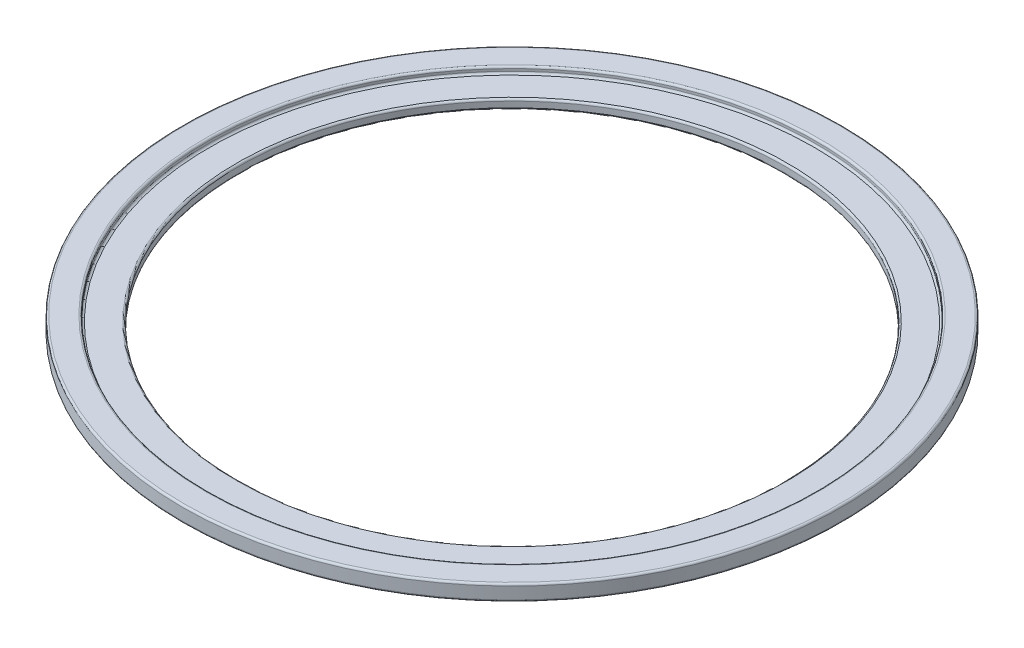
ISO-10303-21;
HEADER;
FILE_DESCRIPTION(('STEP AP214'),'2;1');
FILE_NAME('part.step','',(''),(''),'','','');
FILE_SCHEMA(('AUTOMOTIVE_DESIGN { 1 0 10303 214 1 1 1 1 }'));
ENDSEC;
DATA;
#1=APPLICATION_CONTEXT('core data for automotive mechanical design processes');
#2=APPLICATION_PROTOCOL_DEFINITION('international standard','automotive_design',2000,#1);
#3=PRODUCT_CONTEXT('',#1,'mechanical');
#4=PRODUCT('Part','Part','',(#3));
#5=PRODUCT_RELATED_PRODUCT_CATEGORY('part','',(#4));
#6=PRODUCT_DEFINITION_FORMATION('','',#4);
#7=PRODUCT_DEFINITION_CONTEXT('part definition',#1,'design');
#8=PRODUCT_DEFINITION('design','',#6,#7);
#9=PRODUCT_DEFINITION_SHAPE('','',#8);
#10=(LENGTH_UNIT() NAMED_UNIT(*) SI_UNIT(.MILLI.,.METRE.));
#11=(NAMED_UNIT(*) PLANE_ANGLE_UNIT() SI_UNIT($,.RADIAN.));
#12=(NAMED_UNIT(*) SI_UNIT($,.STERADIAN.) SOLID_ANGLE_UNIT());
#13=UNCERTAINTY_MEASURE_WITH_UNIT(LENGTH_MEASURE(1.E-05),#10,'distance_accuracy_value','');
#14=(GEOMETRIC_REPRESENTATION_CONTEXT(3) GLOBAL_UNCERTAINTY_ASSIGNED_CONTEXT((#13)) GLOBAL_UNIT_ASSIGNED_CONTEXT((#10,
#11,#12)) REPRESENTATION_CONTEXT('',''));
#15=CARTESIAN_POINT('',(0.,0.,0.));
#16=DIRECTION('',(0.,0.,1.));
#17=DIRECTION('',(1.,0.,0.));
#18=AXIS2_PLACEMENT_3D('',#15,#16,#17);
#19=CARTESIAN_POINT('',(0.,3.17320044296789,0.));
#20=DIRECTION('',(0.,-1.,0.));
#21=DIRECTION('',(0.,0.,-1.));
#22=AXIS2_PLACEMENT_3D('',#19,#20,#21);
#23=PLANE('',#22);
#24=CARTESIAN_POINT('',(0.,3.17320044296789,0.));
#25=DIRECTION('',(0.,-1.,0.));
#26=DIRECTION('',(0.,0.,-1.));
#27=AXIS2_PLACEMENT_3D('',#24,#25,#26);
#28=CIRCLE('',#27,42.25);
#29=CARTESIAN_POINT('',(0.,3.17320044296789,-42.25));
#30=VERTEX_POINT('',#29);
#31=EDGE_CURVE('E65',#30,#30,#28,.T.);
#32=ORIENTED_EDGE('',*,*,#31,.T.);
#33=EDGE_LOOP('',(#32));
#34=FACE_BOUND('',#33,.T.);
#35=CARTESIAN_POINT('',(0.,3.17320044296789,0.));
#36=DIRECTION('',(0.,-1.,0.));
#37=DIRECTION('',(0.,0.,-1.));
#38=AXIS2_PLACEMENT_3D('',#35,#36,#37);
#39=CIRCLE('',#38,35.5);
#40=CARTESIAN_POINT('',(0.,3.17320044296789,-35.5));
#41=VERTEX_POINT('',#40);
#42=EDGE_CURVE('E68',#41,#41,#39,.F.);
#43=ORIENTED_EDGE('',*,*,#42,.T.);
#44=EDGE_LOOP('',(#43));
#45=FACE_BOUND('',#44,.T.);
#46=ADVANCED_FACE('F33',(#34,#45),#23,.T.);
#47=CARTESIAN_POINT('',(0.,47.2206533776301,0.));
#48=DIRECTION('',(0.,1.,0.));
#49=DIRECTION('',(0.,0.,1.));
#50=AXIS2_PLACEMENT_3D('',#47,#48,#49);
#51=CYLINDRICAL_SURFACE('',#50,42.5);
#52=CARTESIAN_POINT('',(0.,3.42320044296789,0.));
#53=DIRECTION('',(0.,-1.,0.));
#54=DIRECTION('',(0.,0.,-1.));
#55=AXIS2_PLACEMENT_3D('',#52,#53,#54);
#56=CIRCLE('',#55,42.5);
#57=CARTESIAN_POINT('',(0.,3.42320044296789,-42.5));
#58=VERTEX_POINT('',#57);
#59=EDGE_CURVE('E71',#58,#58,#56,.F.);
#60=ORIENTED_EDGE('',*,*,#59,.T.);
#61=EDGE_LOOP('',(#60));
#62=FACE_BOUND('',#61,.T.);
#63=CARTESIAN_POINT('',(0.,4.97320044296789,0.));
#64=DIRECTION('',(0.,1.,0.));
#65=DIRECTION('',(0.,0.,1.));
#66=AXIS2_PLACEMENT_3D('',#63,#64,#65);
#67=CIRCLE('',#66,42.5);
#68=CARTESIAN_POINT('',(0.,4.97320044296789,42.5));
#69=VERTEX_POINT('',#68);
#70=EDGE_CURVE('E74',#69,#69,#67,.F.);
#71=ORIENTED_EDGE('',*,*,#70,.T.);
#72=EDGE_LOOP('',(#71));
#73=FACE_BOUND('',#72,.T.);
#74=ADVANCED_FACE('F78',(#62,#73),#51,.T.);
#75=CARTESIAN_POINT('',(0.,5.22320044296789,0.));
#76=DIRECTION('',(0.,1.,0.));
#77=DIRECTION('',(0.,0.,1.));
#78=AXIS2_PLACEMENT_3D('',#75,#76,#77);
#79=PLANE('',#78);
#80=CARTESIAN_POINT('',(0.,5.22320044296789,0.));
#81=DIRECTION('',(0.,1.,0.));
#82=DIRECTION('',(0.,0.,1.));
#83=AXIS2_PLACEMENT_3D('',#80,#81,#82);
#84=CIRCLE('',#83,42.25);
#85=CARTESIAN_POINT('',(0.,5.22320044296789,42.25));
#86=VERTEX_POINT('',#85);
#87=EDGE_CURVE('E59',#86,#86,#84,.T.);
#88=ORIENTED_EDGE('',*,*,#87,.T.);
#89=EDGE_LOOP('',(#88));
#90=FACE_BOUND('',#89,.T.);
#91=CARTESIAN_POINT('',(0.,5.22320044296789,0.));
#92=DIRECTION('',(0.,1.,0.));
#93=DIRECTION('',(0.,0.,1.));
#94=AXIS2_PLACEMENT_3D('',#91,#92,#93);
#95=CIRCLE('',#94,39.5);
#96=CARTESIAN_POINT('',(0.,5.22320044296789,39.5));
#97=VERTEX_POINT('',#96);
#98=EDGE_CURVE('E62',#97,#97,#95,.F.);
#99=ORIENTED_EDGE('',*,*,#98,.T.);
#100=EDGE_LOOP('',(#99));
#101=FACE_BOUND('',#100,.T.);
#102=ADVANCED_FACE('F88',(#90,#101),#79,.T.);
#103=CARTESIAN_POINT('',(0.,47.2206533776301,0.));
#104=DIRECTION('',(0.,1.,0.));
#105=DIRECTION('',(0.,0.,1.));
#106=AXIS2_PLACEMENT_3D('',#103,#104,#105);
#107=CYLINDRICAL_SURFACE('',#106,39.25);
#108=CARTESIAN_POINT('',(0.,4.97320044296789,0.));
#109=DIRECTION('',(0.,1.,0.));
#110=DIRECTION('',(0.,0.,1.));
#111=AXIS2_PLACEMENT_3D('',#108,#109,#110);
#112=CIRCLE('',#111,39.25);
#113=CARTESIAN_POINT('',(0.,4.97320044296789,39.25));
#114=VERTEX_POINT('',#113);
#115=EDGE_CURVE('E53',#114,#114,#112,.T.);
#116=ORIENTED_EDGE('',*,*,#115,.T.);
#117=EDGE_LOOP('',(#116));
#118=FACE_BOUND('',#117,.T.);
#119=CARTESIAN_POINT('',(0.,4.67320044296789,0.));
#120=DIRECTION('',(0.,1.,0.));
#121=DIRECTION('',(0.,0.,1.));
#122=AXIS2_PLACEMENT_3D('',#119,#120,#121);
#123=CIRCLE('',#122,39.25);
#124=CARTESIAN_POINT('',(0.,4.67320044296789,39.25));
#125=VERTEX_POINT('',#124);
#126=EDGE_CURVE('E56',#125,#125,#123,.F.);
#127=ORIENTED_EDGE('',*,*,#126,.T.);
#128=EDGE_LOOP('',(#127));
#129=FACE_BOUND('',#128,.T.);
#130=ADVANCED_FACE('F91',(#118,#129),#107,.F.);
#131=CARTESIAN_POINT('',(0.,4.42320044296789,0.));
#132=DIRECTION('',(0.,1.,0.));
#133=DIRECTION('',(0.,0.,1.));
#134=AXIS2_PLACEMENT_3D('',#131,#132,#133);
#135=PLANE('',#134);
#136=CARTESIAN_POINT('',(0.,4.42320044296789,0.));
#137=DIRECTION('',(0.,1.,0.));
#138=DIRECTION('',(0.,0.,1.));
#139=AXIS2_PLACEMENT_3D('',#136,#137,#138);
#140=CIRCLE('',#139,39.);
#141=CARTESIAN_POINT('',(0.,4.42320044296789,39.));
#142=VERTEX_POINT('',#141);
#143=EDGE_CURVE('E44',#142,#142,#140,.T.);
#144=ORIENTED_EDGE('',*,*,#143,.T.);
#145=EDGE_LOOP('',(#144));
#146=FACE_BOUND('',#145,.T.);
#147=CARTESIAN_POINT('',(0.,4.42320044296789,0.));
#148=DIRECTION('',(0.,1.,0.));
#149=DIRECTION('',(0.,0.,1.));
#150=AXIS2_PLACEMENT_3D('',#147,#148,#149);
#151=CIRCLE('',#150,35.5);
#152=CARTESIAN_POINT('',(0.,4.42320044296789,35.5));
#153=VERTEX_POINT('',#152);
#154=EDGE_CURVE('E48',#153,#153,#151,.F.);
#155=ORIENTED_EDGE('',*,*,#154,.T.);
#156=EDGE_LOOP('',(#155));
#157=FACE_BOUND('',#156,.T.);
#158=ADVANCED_FACE('F103',(#146,#157),#135,.T.);
#159=CARTESIAN_POINT('',(0.,47.2206533776301,0.));
#160=DIRECTION('',(0.,1.,0.));
#161=DIRECTION('',(0.,0.,1.));
#162=AXIS2_PLACEMENT_3D('',#159,#160,#161);
#163=CYLINDRICAL_SURFACE('',#162,35.25);
#164=CARTESIAN_POINT('',(0.,4.17320044296789,0.));
#165=DIRECTION('',(0.,1.,0.));
#166=DIRECTION('',(0.,0.,1.));
#167=AXIS2_PLACEMENT_3D('',#164,#165,#166);
#168=CIRCLE('',#167,35.25);
#169=CARTESIAN_POINT('',(0.,4.17320044296789,35.25));
#170=VERTEX_POINT('',#169);
#171=EDGE_CURVE('E10',#170,#170,#168,.T.);
#172=ORIENTED_EDGE('',*,*,#171,.T.);
#173=EDGE_LOOP('',(#172));
#174=FACE_BOUND('',#173,.T.);
#175=CARTESIAN_POINT('',(0.,3.42320044296789,0.));
#176=DIRECTION('',(0.,-1.,0.));
#177=DIRECTION('',(0.,0.,-1.));
#178=AXIS2_PLACEMENT_3D('',#175,#176,#177);
#179=CIRCLE('',#178,35.25);
#180=CARTESIAN_POINT('',(0.,3.42320044296789,-35.25));
#181=VERTEX_POINT('',#180);
#182=EDGE_CURVE('E40',#181,#181,#179,.T.);
#183=ORIENTED_EDGE('',*,*,#182,.T.);
#184=EDGE_LOOP('',(#183));
#185=FACE_BOUND('',#184,.T.);
#186=ADVANCED_FACE('F115',(#174,#185),#163,.F.);
#187=CARTESIAN_POINT('',(0.,3.42320044296789,0.));
#188=DIRECTION('',(0.,-1.,0.));
#189=DIRECTION('',(0.,0.,-1.));
#190=AXIS2_PLACEMENT_3D('',#187,#188,#189);
#191=TOROIDAL_SURFACE('',#190,42.25,0.25);
#192=ORIENTED_EDGE('',*,*,#31,.F.);
#193=EDGE_LOOP('',(#192));
#194=FACE_BOUND('',#193,.T.);
#195=ORIENTED_EDGE('',*,*,#59,.F.);
#196=EDGE_LOOP('',(#195));
#197=FACE_BOUND('',#196,.T.);
#198=ADVANCED_FACE('F84',(#194,#197),#191,.T.);
#199=CARTESIAN_POINT('',(0.,4.97320044296789,0.));
#200=DIRECTION('',(0.,1.,0.));
#201=DIRECTION('',(0.,0.,1.));
#202=AXIS2_PLACEMENT_3D('',#199,#200,#201);
#203=TOROIDAL_SURFACE('',#202,42.25,0.25);
#204=ORIENTED_EDGE('',*,*,#70,.F.);
#205=EDGE_LOOP('',(#204));
#206=FACE_BOUND('',#205,.T.);
#207=ORIENTED_EDGE('',*,*,#87,.F.);
#208=EDGE_LOOP('',(#207));
#209=FACE_BOUND('',#208,.T.);
#210=ADVANCED_FACE('F80',(#206,#209),#203,.T.);
#211=CARTESIAN_POINT('',(0.,4.97320044296789,0.));
#212=DIRECTION('',(0.,1.,0.));
#213=DIRECTION('',(0.,0.,1.));
#214=AXIS2_PLACEMENT_3D('',#211,#212,#213);
#215=TOROIDAL_SURFACE('',#214,39.5,0.25);
#216=ORIENTED_EDGE('',*,*,#98,.F.);
#217=EDGE_LOOP('',(#216));
#218=FACE_BOUND('',#217,.T.);
#219=ORIENTED_EDGE('',*,*,#115,.F.);
#220=EDGE_LOOP('',(#219));
#221=FACE_BOUND('',#220,.T.);
#222=ADVANCED_FACE('F83',(#218,#221),#215,.T.);
#223=CARTESIAN_POINT('',(0.,4.67320044296789,0.));
#224=DIRECTION('',(0.,1.,0.));
#225=DIRECTION('',(0.,0.,1.));
#226=AXIS2_PLACEMENT_3D('',#223,#224,#225);
#227=TOROIDAL_SURFACE('',#226,39.,0.25);
#228=ORIENTED_EDGE('',*,*,#126,.F.);
#229=EDGE_LOOP('',(#228));
#230=FACE_BOUND('',#229,.T.);
#231=ORIENTED_EDGE('',*,*,#143,.F.);
#232=EDGE_LOOP('',(#231));
#233=FACE_BOUND('',#232,.T.);
#234=ADVANCED_FACE('F97',(#230,#233),#227,.F.);
#235=CARTESIAN_POINT('',(0.,4.17320044296789,0.));
#236=DIRECTION('',(0.,1.,0.));
#237=DIRECTION('',(0.,0.,1.));
#238=AXIS2_PLACEMENT_3D('',#235,#236,#237);
#239=TOROIDAL_SURFACE('',#238,35.5,0.25);
#240=ORIENTED_EDGE('',*,*,#154,.F.);
#241=EDGE_LOOP('',(#240));
#242=FACE_BOUND('',#241,.T.);
#243=ORIENTED_EDGE('',*,*,#171,.F.);
#244=EDGE_LOOP('',(#243));
#245=FACE_BOUND('',#244,.T.);
#246=ADVANCED_FACE('F109',(#242,#245),#239,.T.);
#247=CARTESIAN_POINT('',(0.,3.42320044296789,0.));
#248=DIRECTION('',(0.,-1.,0.));
#249=DIRECTION('',(0.,0.,-1.));
#250=AXIS2_PLACEMENT_3D('',#247,#248,#249);
#251=TOROIDAL_SURFACE('',#250,35.5,0.25);
#252=ORIENTED_EDGE('',*,*,#182,.F.);
#253=EDGE_LOOP('',(#252));
#254=FACE_BOUND('',#253,.T.);
#255=ORIENTED_EDGE('',*,*,#42,.F.);
#256=EDGE_LOOP('',(#255));
#257=FACE_BOUND('',#256,.T.);
#258=ADVANCED_FACE('F35',(#254,#257),#251,.T.);
#259=CLOSED_SHELL('',(#46,#74,#102,#130,#158,#186,#198,#210,#222,#234,#246,#258));
#260=MANIFOLD_SOLID_BREP('B2',#259);
#261=ADVANCED_BREP_SHAPE_REPRESENTATION('',(#18,#260),#14);
#262=SHAPE_DEFINITION_REPRESENTATION(#9,#261);
ENDSEC;
END-ISO-10303-21;
